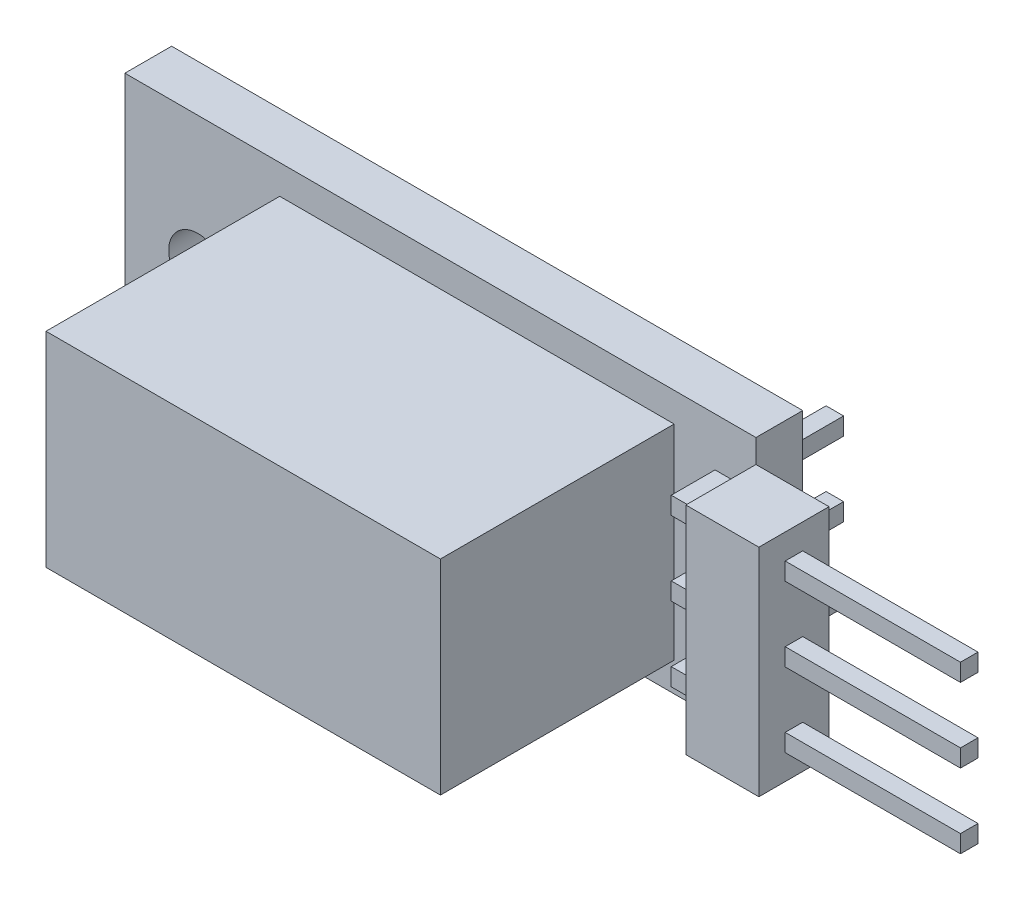
ISO-10303-21;
HEADER;
FILE_DESCRIPTION(('STEP AP214'),'2;1');
FILE_NAME('part.step','',(''),(''),'','','');
FILE_SCHEMA(('AUTOMOTIVE_DESIGN { 1 0 10303 214 1 1 1 1 }'));
ENDSEC;
DATA;
#1=APPLICATION_CONTEXT('core data for automotive mechanical design processes');
#2=APPLICATION_PROTOCOL_DEFINITION('international standard','automotive_design',2000,#1);
#3=PRODUCT_CONTEXT('',#1,'mechanical');
#4=PRODUCT('Part','Part','',(#3));
#5=PRODUCT_RELATED_PRODUCT_CATEGORY('part','',(#4));
#6=PRODUCT_DEFINITION_FORMATION('','',#4);
#7=PRODUCT_DEFINITION_CONTEXT('part definition',#1,'design');
#8=PRODUCT_DEFINITION('design','',#6,#7);
#9=PRODUCT_DEFINITION_SHAPE('','',#8);
#10=(LENGTH_UNIT() NAMED_UNIT(*) SI_UNIT(.MILLI.,.METRE.));
#11=(NAMED_UNIT(*) PLANE_ANGLE_UNIT() SI_UNIT($,.RADIAN.));
#12=(NAMED_UNIT(*) SI_UNIT($,.STERADIAN.) SOLID_ANGLE_UNIT());
#13=UNCERTAINTY_MEASURE_WITH_UNIT(LENGTH_MEASURE(1.E-05),#10,'distance_accuracy_value','');
#14=(GEOMETRIC_REPRESENTATION_CONTEXT(3) GLOBAL_UNCERTAINTY_ASSIGNED_CONTEXT((#13)) GLOBAL_UNIT_ASSIGNED_CONTEXT((#10,
#11,#12)) REPRESENTATION_CONTEXT('',''));
#15=CARTESIAN_POINT('',(0.,0.,0.));
#16=DIRECTION('',(0.,0.,1.));
#17=DIRECTION('',(1.,0.,0.));
#18=AXIS2_PLACEMENT_3D('',#15,#16,#17);
#19=CARTESIAN_POINT('',(30.1,6.74,2.5));
#20=DIRECTION('',(-1.,0.,0.));
#21=DIRECTION('',(0.,0.,1.));
#22=AXIS2_PLACEMENT_3D('',#19,#20,#21);
#23=PLANE('',#22);
#24=DIRECTION('',(0.,0.,1.));
#25=VECTOR('',#24,1.);
#26=CARTESIAN_POINT('',(30.1,7.34,2.5));
#27=LINE('',#26,#25);
#28=CARTESIAN_POINT('',(30.1,7.34,2.5));
#29=VERTEX_POINT('',#28);
#30=CARTESIAN_POINT('',(30.1,7.34,3.1));
#31=VERTEX_POINT('',#30);
#32=EDGE_CURVE('E129',#29,#31,#27,.T.);
#33=ORIENTED_EDGE('',*,*,#32,.T.);
#34=DIRECTION('',(0.,1.,0.));
#35=VECTOR('',#34,1.);
#36=CARTESIAN_POINT('',(30.1,6.74,3.1));
#37=LINE('',#36,#35);
#38=CARTESIAN_POINT('',(30.1,6.74,3.1));
#39=VERTEX_POINT('',#38);
#40=EDGE_CURVE('E12',#39,#31,#37,.T.);
#41=ORIENTED_EDGE('',*,*,#40,.F.);
#42=DIRECTION('',(0.,0.,1.));
#43=VECTOR('',#42,1.);
#44=CARTESIAN_POINT('',(30.1,6.74,2.5));
#45=LINE('',#44,#43);
#46=CARTESIAN_POINT('',(30.1,6.74,2.5));
#47=VERTEX_POINT('',#46);
#48=EDGE_CURVE('E139',#47,#39,#45,.T.);
#49=ORIENTED_EDGE('',*,*,#48,.F.);
#50=DIRECTION('',(0.,1.,0.));
#51=VECTOR('',#50,1.);
#52=CARTESIAN_POINT('',(30.1,6.74,2.5));
#53=LINE('',#52,#51);
#54=EDGE_CURVE('E125',#47,#29,#53,.T.);
#55=ORIENTED_EDGE('',*,*,#54,.T.);
#56=EDGE_LOOP('',(#33,#41,#49,#55));
#57=FACE_BOUND('',#56,.T.);
#58=ADVANCED_FACE('F45',(#57),#23,.F.);
#59=CARTESIAN_POINT('',(30.1,6.74,3.1));
#60=DIRECTION('',(0.,0.,-1.));
#61=DIRECTION('',(0.,1.,0.));
#62=AXIS2_PLACEMENT_3D('',#59,#60,#61);
#63=PLANE('',#62);
#64=DIRECTION('',(-1.,0.,0.));
#65=VECTOR('',#64,1.);
#66=CARTESIAN_POINT('',(30.1,7.34,3.1));
#67=LINE('',#66,#65);
#68=CARTESIAN_POINT('',(20.2,7.34,3.1));
#69=VERTEX_POINT('',#68);
#70=EDGE_CURVE('E132',#31,#69,#67,.T.);
#71=ORIENTED_EDGE('',*,*,#70,.T.);
#72=DIRECTION('',(0.,1.,0.));
#73=VECTOR('',#72,1.);
#74=CARTESIAN_POINT('',(20.2,6.74,3.1));
#75=LINE('',#74,#73);
#76=CARTESIAN_POINT('',(20.2,6.74,3.1));
#77=VERTEX_POINT('',#76);
#78=EDGE_CURVE('E53',#77,#69,#75,.T.);
#79=ORIENTED_EDGE('',*,*,#78,.F.);
#80=DIRECTION('',(-1.,0.,0.));
#81=VECTOR('',#80,1.);
#82=CARTESIAN_POINT('',(30.1,6.74,3.1));
#83=LINE('',#82,#81);
#84=EDGE_CURVE('E98',#39,#77,#83,.T.);
#85=ORIENTED_EDGE('',*,*,#84,.F.);
#86=ORIENTED_EDGE('',*,*,#40,.T.);
#87=EDGE_LOOP('',(#71,#79,#85,#86));
#88=FACE_BOUND('',#87,.T.);
#89=ADVANCED_FACE('F163',(#88),#63,.F.);
#90=CARTESIAN_POINT('',(20.2,6.74,3.1));
#91=DIRECTION('',(1.,0.,0.));
#92=DIRECTION('',(0.,0.,-1.));
#93=AXIS2_PLACEMENT_3D('',#90,#91,#92);
#94=PLANE('',#93);
#95=DIRECTION('',(0.,0.,-1.));
#96=VECTOR('',#95,1.);
#97=CARTESIAN_POINT('',(20.2,7.34,3.1));
#98=LINE('',#97,#96);
#99=CARTESIAN_POINT('',(20.2,7.34,-2.2));
#100=VERTEX_POINT('',#99);
#101=EDGE_CURVE('E134',#69,#100,#98,.T.);
#102=ORIENTED_EDGE('',*,*,#101,.T.);
#103=DIRECTION('',(0.,1.,0.));
#104=VECTOR('',#103,1.);
#105=CARTESIAN_POINT('',(20.2,6.74,-2.2));
#106=LINE('',#105,#104);
#107=CARTESIAN_POINT('',(20.2,6.74,-2.2));
#108=VERTEX_POINT('',#107);
#109=EDGE_CURVE('E120',#108,#100,#106,.T.);
#110=ORIENTED_EDGE('',*,*,#109,.F.);
#111=DIRECTION('',(0.,0.,-1.));
#112=VECTOR('',#111,1.);
#113=CARTESIAN_POINT('',(20.2,6.74,3.1));
#114=LINE('',#113,#112);
#115=EDGE_CURVE('E111',#77,#108,#114,.T.);
#116=ORIENTED_EDGE('',*,*,#115,.F.);
#117=ORIENTED_EDGE('',*,*,#78,.T.);
#118=EDGE_LOOP('',(#102,#110,#116,#117));
#119=FACE_BOUND('',#118,.T.);
#120=ADVANCED_FACE('F145',(#119),#94,.F.);
#121=CARTESIAN_POINT('',(20.2,6.74,-2.2));
#122=DIRECTION('',(0.,0.,1.));
#123=DIRECTION('',(0.,-1.,0.));
#124=AXIS2_PLACEMENT_3D('',#121,#122,#123);
#125=PLANE('',#124);
#126=DIRECTION('',(1.,0.,0.));
#127=VECTOR('',#126,1.);
#128=CARTESIAN_POINT('',(20.2,7.34,-2.2));
#129=LINE('',#128,#127);
#130=CARTESIAN_POINT('',(20.8,7.34,-2.2));
#131=VERTEX_POINT('',#130);
#132=EDGE_CURVE('E119',#100,#131,#129,.T.);
#133=ORIENTED_EDGE('',*,*,#132,.T.);
#134=DIRECTION('',(0.,1.,0.));
#135=VECTOR('',#134,1.);
#136=CARTESIAN_POINT('',(20.8,6.74,-2.2));
#137=LINE('',#136,#135);
#138=CARTESIAN_POINT('',(20.8,6.74,-2.2));
#139=VERTEX_POINT('',#138);
#140=EDGE_CURVE('E116',#139,#131,#137,.T.);
#141=ORIENTED_EDGE('',*,*,#140,.F.);
#142=DIRECTION('',(1.,0.,0.));
#143=VECTOR('',#142,1.);
#144=CARTESIAN_POINT('',(20.2,6.74,-2.2));
#145=LINE('',#144,#143);
#146=EDGE_CURVE('E105',#108,#139,#145,.T.);
#147=ORIENTED_EDGE('',*,*,#146,.F.);
#148=ORIENTED_EDGE('',*,*,#109,.T.);
#149=EDGE_LOOP('',(#133,#141,#147,#148));
#150=FACE_BOUND('',#149,.T.);
#151=ADVANCED_FACE('F117',(#150),#125,.F.);
#152=CARTESIAN_POINT('',(20.8,6.74,-2.2));
#153=DIRECTION('',(-1.,0.,0.));
#154=DIRECTION('',(0.,0.,1.));
#155=AXIS2_PLACEMENT_3D('',#152,#153,#154);
#156=PLANE('',#155);
#157=DIRECTION('',(0.,0.,1.));
#158=VECTOR('',#157,1.);
#159=CARTESIAN_POINT('',(20.8,7.34,-2.2));
#160=LINE('',#159,#158);
#161=CARTESIAN_POINT('',(20.8,7.34,2.5));
#162=VERTEX_POINT('',#161);
#163=EDGE_CURVE('E84',#131,#162,#160,.T.);
#164=ORIENTED_EDGE('',*,*,#163,.T.);
#165=DIRECTION('',(0.,1.,0.));
#166=VECTOR('',#165,1.);
#167=CARTESIAN_POINT('',(20.8,6.74,2.5));
#168=LINE('',#167,#166);
#169=CARTESIAN_POINT('',(20.8,6.74,2.5));
#170=VERTEX_POINT('',#169);
#171=EDGE_CURVE('E121',#170,#162,#168,.T.);
#172=ORIENTED_EDGE('',*,*,#171,.F.);
#173=DIRECTION('',(0.,0.,1.));
#174=VECTOR('',#173,1.);
#175=CARTESIAN_POINT('',(20.8,6.74,-2.2));
#176=LINE('',#175,#174);
#177=EDGE_CURVE('E109',#139,#170,#176,.T.);
#178=ORIENTED_EDGE('',*,*,#177,.F.);
#179=ORIENTED_EDGE('',*,*,#140,.T.);
#180=EDGE_LOOP('',(#164,#172,#178,#179));
#181=FACE_BOUND('',#180,.T.);
#182=ADVANCED_FACE('F123',(#181),#156,.F.);
#183=CARTESIAN_POINT('',(20.8,6.74,2.5));
#184=DIRECTION('',(0.,0.,1.));
#185=DIRECTION('',(0.,-1.,0.));
#186=AXIS2_PLACEMENT_3D('',#183,#184,#185);
#187=PLANE('',#186);
#188=DIRECTION('',(1.,0.,0.));
#189=VECTOR('',#188,1.);
#190=CARTESIAN_POINT('',(20.8,7.34,2.5));
#191=LINE('',#190,#189);
#192=EDGE_CURVE('E90',#162,#29,#191,.T.);
#193=ORIENTED_EDGE('',*,*,#192,.T.);
#194=ORIENTED_EDGE('',*,*,#54,.F.);
#195=DIRECTION('',(1.,0.,0.));
#196=VECTOR('',#195,1.);
#197=CARTESIAN_POINT('',(20.8,6.74,2.5));
#198=LINE('',#197,#196);
#199=EDGE_CURVE('E61',#170,#47,#198,.T.);
#200=ORIENTED_EDGE('',*,*,#199,.F.);
#201=ORIENTED_EDGE('',*,*,#171,.T.);
#202=EDGE_LOOP('',(#193,#194,#200,#201));
#203=FACE_BOUND('',#202,.T.);
#204=ADVANCED_FACE('F152',(#203),#187,.F.);
#205=CARTESIAN_POINT('',(0.,6.74,0.));
#206=DIRECTION('',(0.,-1.,0.));
#207=DIRECTION('',(0.,0.,-1.));
#208=AXIS2_PLACEMENT_3D('',#205,#206,#207);
#209=PLANE('',#208);
#210=ORIENTED_EDGE('',*,*,#48,.T.);
#211=ORIENTED_EDGE('',*,*,#84,.T.);
#212=ORIENTED_EDGE('',*,*,#115,.T.);
#213=ORIENTED_EDGE('',*,*,#146,.T.);
#214=ORIENTED_EDGE('',*,*,#177,.T.);
#215=ORIENTED_EDGE('',*,*,#199,.T.);
#216=EDGE_LOOP('',(#210,#211,#212,#213,#214,#215));
#217=FACE_BOUND('',#216,.T.);
#218=ADVANCED_FACE('F107',(#217),#209,.T.);
#219=CARTESIAN_POINT('',(0.,7.34,0.));
#220=DIRECTION('',(0.,-1.,0.));
#221=DIRECTION('',(0.,0.,-1.));
#222=AXIS2_PLACEMENT_3D('',#219,#220,#221);
#223=PLANE('',#222);
#224=ORIENTED_EDGE('',*,*,#32,.F.);
#225=ORIENTED_EDGE('',*,*,#192,.F.);
#226=ORIENTED_EDGE('',*,*,#163,.F.);
#227=ORIENTED_EDGE('',*,*,#132,.F.);
#228=ORIENTED_EDGE('',*,*,#101,.F.);
#229=ORIENTED_EDGE('',*,*,#70,.F.);
#230=EDGE_LOOP('',(#224,#225,#226,#227,#228,#229));
#231=FACE_BOUND('',#230,.T.);
#232=ADVANCED_FACE('F148',(#231),#223,.F.);
#233=CLOSED_SHELL('',(#58,#89,#120,#151,#182,#204,#218,#232));
#234=MANIFOLD_SOLID_BREP('B2',#233);
#235=CARTESIAN_POINT('',(30.1,4.2,2.5));
#236=DIRECTION('',(-1.,0.,0.));
#237=DIRECTION('',(0.,0.,1.));
#238=AXIS2_PLACEMENT_3D('',#235,#236,#237);
#239=PLANE('',#238);
#240=DIRECTION('',(0.,0.,1.));
#241=VECTOR('',#240,1.);
#242=CARTESIAN_POINT('',(30.1,4.8,2.5));
#243=LINE('',#242,#241);
#244=CARTESIAN_POINT('',(30.1,4.8,2.5));
#245=VERTEX_POINT('',#244);
#246=CARTESIAN_POINT('',(30.1,4.8,3.1));
#247=VERTEX_POINT('',#246);
#248=EDGE_CURVE('E314',#245,#247,#243,.T.);
#249=ORIENTED_EDGE('',*,*,#248,.T.);
#250=DIRECTION('',(0.,1.,0.));
#251=VECTOR('',#250,1.);
#252=CARTESIAN_POINT('',(30.1,4.2,3.1));
#253=LINE('',#252,#251);
#254=CARTESIAN_POINT('',(30.1,4.2,3.1));
#255=VERTEX_POINT('',#254);
#256=EDGE_CURVE('E43',#255,#247,#253,.T.);
#257=ORIENTED_EDGE('',*,*,#256,.F.);
#258=DIRECTION('',(0.,0.,1.));
#259=VECTOR('',#258,1.);
#260=CARTESIAN_POINT('',(30.1,4.2,2.5));
#261=LINE('',#260,#259);
#262=CARTESIAN_POINT('',(30.1,4.2,2.5));
#263=VERTEX_POINT('',#262);
#264=EDGE_CURVE('E324',#263,#255,#261,.T.);
#265=ORIENTED_EDGE('',*,*,#264,.F.);
#266=DIRECTION('',(0.,1.,0.));
#267=VECTOR('',#266,1.);
#268=CARTESIAN_POINT('',(30.1,4.2,2.5));
#269=LINE('',#268,#267);
#270=EDGE_CURVE('E310',#263,#245,#269,.T.);
#271=ORIENTED_EDGE('',*,*,#270,.T.);
#272=EDGE_LOOP('',(#249,#257,#265,#271));
#273=FACE_BOUND('',#272,.T.);
#274=ADVANCED_FACE('F230',(#273),#239,.F.);
#275=CARTESIAN_POINT('',(30.1,4.2,3.1));
#276=DIRECTION('',(0.,0.,-1.));
#277=DIRECTION('',(0.,1.,0.));
#278=AXIS2_PLACEMENT_3D('',#275,#276,#277);
#279=PLANE('',#278);
#280=DIRECTION('',(-1.,0.,0.));
#281=VECTOR('',#280,1.);
#282=CARTESIAN_POINT('',(30.1,4.8,3.1));
#283=LINE('',#282,#281);
#284=CARTESIAN_POINT('',(20.2,4.8,3.1));
#285=VERTEX_POINT('',#284);
#286=EDGE_CURVE('E317',#247,#285,#283,.T.);
#287=ORIENTED_EDGE('',*,*,#286,.T.);
#288=DIRECTION('',(0.,1.,0.));
#289=VECTOR('',#288,1.);
#290=CARTESIAN_POINT('',(20.2,4.2,3.1));
#291=LINE('',#290,#289);
#292=CARTESIAN_POINT('',(20.2,4.2,3.1));
#293=VERTEX_POINT('',#292);
#294=EDGE_CURVE('E238',#293,#285,#291,.T.);
#295=ORIENTED_EDGE('',*,*,#294,.F.);
#296=DIRECTION('',(-1.,0.,0.));
#297=VECTOR('',#296,1.);
#298=CARTESIAN_POINT('',(30.1,4.2,3.1));
#299=LINE('',#298,#297);
#300=EDGE_CURVE('E283',#255,#293,#299,.T.);
#301=ORIENTED_EDGE('',*,*,#300,.F.);
#302=ORIENTED_EDGE('',*,*,#256,.T.);
#303=EDGE_LOOP('',(#287,#295,#301,#302));
#304=FACE_BOUND('',#303,.T.);
#305=ADVANCED_FACE('F348',(#304),#279,.F.);
#306=CARTESIAN_POINT('',(20.2,4.2,3.1));
#307=DIRECTION('',(1.,0.,0.));
#308=DIRECTION('',(0.,0.,-1.));
#309=AXIS2_PLACEMENT_3D('',#306,#307,#308);
#310=PLANE('',#309);
#311=DIRECTION('',(0.,0.,-1.));
#312=VECTOR('',#311,1.);
#313=CARTESIAN_POINT('',(20.2,4.8,3.1));
#314=LINE('',#313,#312);
#315=CARTESIAN_POINT('',(20.2,4.8,-2.2));
#316=VERTEX_POINT('',#315);
#317=EDGE_CURVE('E319',#285,#316,#314,.T.);
#318=ORIENTED_EDGE('',*,*,#317,.T.);
#319=DIRECTION('',(0.,1.,0.));
#320=VECTOR('',#319,1.);
#321=CARTESIAN_POINT('',(20.2,4.2,-2.2));
#322=LINE('',#321,#320);
#323=CARTESIAN_POINT('',(20.2,4.2,-2.2));
#324=VERTEX_POINT('',#323);
#325=EDGE_CURVE('E305',#324,#316,#322,.T.);
#326=ORIENTED_EDGE('',*,*,#325,.F.);
#327=DIRECTION('',(0.,0.,-1.));
#328=VECTOR('',#327,1.);
#329=CARTESIAN_POINT('',(20.2,4.2,3.1));
#330=LINE('',#329,#328);
#331=EDGE_CURVE('E296',#293,#324,#330,.T.);
#332=ORIENTED_EDGE('',*,*,#331,.F.);
#333=ORIENTED_EDGE('',*,*,#294,.T.);
#334=EDGE_LOOP('',(#318,#326,#332,#333));
#335=FACE_BOUND('',#334,.T.);
#336=ADVANCED_FACE('F330',(#335),#310,.F.);
#337=CARTESIAN_POINT('',(20.2,4.2,-2.2));
#338=DIRECTION('',(0.,0.,1.));
#339=DIRECTION('',(0.,-1.,0.));
#340=AXIS2_PLACEMENT_3D('',#337,#338,#339);
#341=PLANE('',#340);
#342=DIRECTION('',(1.,0.,0.));
#343=VECTOR('',#342,1.);
#344=CARTESIAN_POINT('',(20.2,4.8,-2.2));
#345=LINE('',#344,#343);
#346=CARTESIAN_POINT('',(20.8,4.8,-2.2));
#347=VERTEX_POINT('',#346);
#348=EDGE_CURVE('E304',#316,#347,#345,.T.);
#349=ORIENTED_EDGE('',*,*,#348,.T.);
#350=DIRECTION('',(0.,1.,0.));
#351=VECTOR('',#350,1.);
#352=CARTESIAN_POINT('',(20.8,4.2,-2.2));
#353=LINE('',#352,#351);
#354=CARTESIAN_POINT('',(20.8,4.2,-2.2));
#355=VERTEX_POINT('',#354);
#356=EDGE_CURVE('E301',#355,#347,#353,.T.);
#357=ORIENTED_EDGE('',*,*,#356,.F.);
#358=DIRECTION('',(1.,0.,0.));
#359=VECTOR('',#358,1.);
#360=CARTESIAN_POINT('',(20.2,4.2,-2.2));
#361=LINE('',#360,#359);
#362=EDGE_CURVE('E290',#324,#355,#361,.T.);
#363=ORIENTED_EDGE('',*,*,#362,.F.);
#364=ORIENTED_EDGE('',*,*,#325,.T.);
#365=EDGE_LOOP('',(#349,#357,#363,#364));
#366=FACE_BOUND('',#365,.T.);
#367=ADVANCED_FACE('F302',(#366),#341,.F.);
#368=CARTESIAN_POINT('',(20.8,4.2,-2.2));
#369=DIRECTION('',(-1.,0.,0.));
#370=DIRECTION('',(0.,0.,1.));
#371=AXIS2_PLACEMENT_3D('',#368,#369,#370);
#372=PLANE('',#371);
#373=DIRECTION('',(0.,0.,1.));
#374=VECTOR('',#373,1.);
#375=CARTESIAN_POINT('',(20.8,4.8,-2.2));
#376=LINE('',#375,#374);
#377=CARTESIAN_POINT('',(20.8,4.8,2.5));
#378=VERTEX_POINT('',#377);
#379=EDGE_CURVE('E269',#347,#378,#376,.T.);
#380=ORIENTED_EDGE('',*,*,#379,.T.);
#381=DIRECTION('',(0.,1.,0.));
#382=VECTOR('',#381,1.);
#383=CARTESIAN_POINT('',(20.8,4.2,2.5));
#384=LINE('',#383,#382);
#385=CARTESIAN_POINT('',(20.8,4.2,2.5));
#386=VERTEX_POINT('',#385);
#387=EDGE_CURVE('E306',#386,#378,#384,.T.);
#388=ORIENTED_EDGE('',*,*,#387,.F.);
#389=DIRECTION('',(0.,0.,1.));
#390=VECTOR('',#389,1.);
#391=CARTESIAN_POINT('',(20.8,4.2,-2.2));
#392=LINE('',#391,#390);
#393=EDGE_CURVE('E294',#355,#386,#392,.T.);
#394=ORIENTED_EDGE('',*,*,#393,.F.);
#395=ORIENTED_EDGE('',*,*,#356,.T.);
#396=EDGE_LOOP('',(#380,#388,#394,#395));
#397=FACE_BOUND('',#396,.T.);
#398=ADVANCED_FACE('F308',(#397),#372,.F.);
#399=CARTESIAN_POINT('',(20.8,4.2,2.5));
#400=DIRECTION('',(0.,0.,1.));
#401=DIRECTION('',(0.,-1.,0.));
#402=AXIS2_PLACEMENT_3D('',#399,#400,#401);
#403=PLANE('',#402);
#404=DIRECTION('',(1.,0.,0.));
#405=VECTOR('',#404,1.);
#406=CARTESIAN_POINT('',(20.8,4.8,2.5));
#407=LINE('',#406,#405);
#408=EDGE_CURVE('E275',#378,#245,#407,.T.);
#409=ORIENTED_EDGE('',*,*,#408,.T.);
#410=ORIENTED_EDGE('',*,*,#270,.F.);
#411=DIRECTION('',(1.,0.,0.));
#412=VECTOR('',#411,1.);
#413=CARTESIAN_POINT('',(20.8,4.2,2.5));
#414=LINE('',#413,#412);
#415=EDGE_CURVE('E246',#386,#263,#414,.T.);
#416=ORIENTED_EDGE('',*,*,#415,.F.);
#417=ORIENTED_EDGE('',*,*,#387,.T.);
#418=EDGE_LOOP('',(#409,#410,#416,#417));
#419=FACE_BOUND('',#418,.T.);
#420=ADVANCED_FACE('F337',(#419),#403,.F.);
#421=CARTESIAN_POINT('',(0.,4.2,0.));
#422=DIRECTION('',(0.,-1.,0.));
#423=DIRECTION('',(0.,0.,-1.));
#424=AXIS2_PLACEMENT_3D('',#421,#422,#423);
#425=PLANE('',#424);
#426=ORIENTED_EDGE('',*,*,#264,.T.);
#427=ORIENTED_EDGE('',*,*,#300,.T.);
#428=ORIENTED_EDGE('',*,*,#331,.T.);
#429=ORIENTED_EDGE('',*,*,#362,.T.);
#430=ORIENTED_EDGE('',*,*,#393,.T.);
#431=ORIENTED_EDGE('',*,*,#415,.T.);
#432=EDGE_LOOP('',(#426,#427,#428,#429,#430,#431));
#433=FACE_BOUND('',#432,.T.);
#434=ADVANCED_FACE('F292',(#433),#425,.T.);
#435=CARTESIAN_POINT('',(0.,4.8,0.));
#436=DIRECTION('',(0.,-1.,0.));
#437=DIRECTION('',(0.,0.,-1.));
#438=AXIS2_PLACEMENT_3D('',#435,#436,#437);
#439=PLANE('',#438);
#440=ORIENTED_EDGE('',*,*,#248,.F.);
#441=ORIENTED_EDGE('',*,*,#408,.F.);
#442=ORIENTED_EDGE('',*,*,#379,.F.);
#443=ORIENTED_EDGE('',*,*,#348,.F.);
#444=ORIENTED_EDGE('',*,*,#317,.F.);
#445=ORIENTED_EDGE('',*,*,#286,.F.);
#446=EDGE_LOOP('',(#440,#441,#442,#443,#444,#445));
#447=FACE_BOUND('',#446,.T.);
#448=ADVANCED_FACE('F333',(#447),#439,.F.);
#449=CLOSED_SHELL('',(#274,#305,#336,#367,#398,#420,#434,#448));
#450=MANIFOLD_SOLID_BREP('B6',#449);
#451=CARTESIAN_POINT('',(30.1,1.66,2.5));
#452=DIRECTION('',(-1.,0.,0.));
#453=DIRECTION('',(0.,0.,1.));
#454=AXIS2_PLACEMENT_3D('',#451,#452,#453);
#455=PLANE('',#454);
#456=DIRECTION('',(0.,0.,1.));
#457=VECTOR('',#456,1.);
#458=CARTESIAN_POINT('',(30.1,2.26,2.5));
#459=LINE('',#458,#457);
#460=CARTESIAN_POINT('',(30.1,2.26,2.5));
#461=VERTEX_POINT('',#460);
#462=CARTESIAN_POINT('',(30.1,2.26,3.1));
#463=VERTEX_POINT('',#462);
#464=EDGE_CURVE('E499',#461,#463,#459,.T.);
#465=ORIENTED_EDGE('',*,*,#464,.T.);
#466=DIRECTION('',(0.,1.,0.));
#467=VECTOR('',#466,1.);
#468=CARTESIAN_POINT('',(30.1,1.66,3.1));
#469=LINE('',#468,#467);
#470=CARTESIAN_POINT('',(30.1,1.66,3.1));
#471=VERTEX_POINT('',#470);
#472=EDGE_CURVE('E228',#471,#463,#469,.T.);
#473=ORIENTED_EDGE('',*,*,#472,.F.);
#474=DIRECTION('',(0.,0.,1.));
#475=VECTOR('',#474,1.);
#476=CARTESIAN_POINT('',(30.1,1.66,2.5));
#477=LINE('',#476,#475);
#478=CARTESIAN_POINT('',(30.1,1.66,2.5));
#479=VERTEX_POINT('',#478);
#480=EDGE_CURVE('E509',#479,#471,#477,.T.);
#481=ORIENTED_EDGE('',*,*,#480,.F.);
#482=DIRECTION('',(0.,1.,0.));
#483=VECTOR('',#482,1.);
#484=CARTESIAN_POINT('',(30.1,1.66,2.5));
#485=LINE('',#484,#483);
#486=EDGE_CURVE('E495',#479,#461,#485,.T.);
#487=ORIENTED_EDGE('',*,*,#486,.T.);
#488=EDGE_LOOP('',(#465,#473,#481,#487));
#489=FACE_BOUND('',#488,.T.);
#490=ADVANCED_FACE('F415',(#489),#455,.F.);
#491=CARTESIAN_POINT('',(30.1,1.66,3.1));
#492=DIRECTION('',(0.,0.,-1.));
#493=DIRECTION('',(0.,1.,0.));
#494=AXIS2_PLACEMENT_3D('',#491,#492,#493);
#495=PLANE('',#494);
#496=DIRECTION('',(-1.,0.,0.));
#497=VECTOR('',#496,1.);
#498=CARTESIAN_POINT('',(30.1,2.26,3.1));
#499=LINE('',#498,#497);
#500=CARTESIAN_POINT('',(20.2,2.26,3.1));
#501=VERTEX_POINT('',#500);
#502=EDGE_CURVE('E502',#463,#501,#499,.T.);
#503=ORIENTED_EDGE('',*,*,#502,.T.);
#504=DIRECTION('',(0.,1.,0.));
#505=VECTOR('',#504,1.);
#506=CARTESIAN_POINT('',(20.2,1.66,3.1));
#507=LINE('',#506,#505);
#508=CARTESIAN_POINT('',(20.2,1.66,3.1));
#509=VERTEX_POINT('',#508);
#510=EDGE_CURVE('E423',#509,#501,#507,.T.);
#511=ORIENTED_EDGE('',*,*,#510,.F.);
#512=DIRECTION('',(-1.,0.,0.));
#513=VECTOR('',#512,1.);
#514=CARTESIAN_POINT('',(30.1,1.66,3.1));
#515=LINE('',#514,#513);
#516=EDGE_CURVE('E468',#471,#509,#515,.T.);
#517=ORIENTED_EDGE('',*,*,#516,.F.);
#518=ORIENTED_EDGE('',*,*,#472,.T.);
#519=EDGE_LOOP('',(#503,#511,#517,#518));
#520=FACE_BOUND('',#519,.T.);
#521=ADVANCED_FACE('F533',(#520),#495,.F.);
#522=CARTESIAN_POINT('',(20.2,1.66,3.1));
#523=DIRECTION('',(1.,0.,0.));
#524=DIRECTION('',(0.,0.,-1.));
#525=AXIS2_PLACEMENT_3D('',#522,#523,#524);
#526=PLANE('',#525);
#527=DIRECTION('',(0.,0.,-1.));
#528=VECTOR('',#527,1.);
#529=CARTESIAN_POINT('',(20.2,2.26,3.1));
#530=LINE('',#529,#528);
#531=CARTESIAN_POINT('',(20.2,2.26,-2.2));
#532=VERTEX_POINT('',#531);
#533=EDGE_CURVE('E504',#501,#532,#530,.T.);
#534=ORIENTED_EDGE('',*,*,#533,.T.);
#535=DIRECTION('',(0.,1.,0.));
#536=VECTOR('',#535,1.);
#537=CARTESIAN_POINT('',(20.2,1.66,-2.2));
#538=LINE('',#537,#536);
#539=CARTESIAN_POINT('',(20.2,1.66,-2.2));
#540=VERTEX_POINT('',#539);
#541=EDGE_CURVE('E490',#540,#532,#538,.T.);
#542=ORIENTED_EDGE('',*,*,#541,.F.);
#543=DIRECTION('',(0.,0.,-1.));
#544=VECTOR('',#543,1.);
#545=CARTESIAN_POINT('',(20.2,1.66,3.1));
#546=LINE('',#545,#544);
#547=EDGE_CURVE('E481',#509,#540,#546,.T.);
#548=ORIENTED_EDGE('',*,*,#547,.F.);
#549=ORIENTED_EDGE('',*,*,#510,.T.);
#550=EDGE_LOOP('',(#534,#542,#548,#549));
#551=FACE_BOUND('',#550,.T.);
#552=ADVANCED_FACE('F515',(#551),#526,.F.);
#553=CARTESIAN_POINT('',(20.2,1.66,-2.2));
#554=DIRECTION('',(0.,0.,1.));
#555=DIRECTION('',(0.,-1.,0.));
#556=AXIS2_PLACEMENT_3D('',#553,#554,#555);
#557=PLANE('',#556);
#558=DIRECTION('',(1.,0.,0.));
#559=VECTOR('',#558,1.);
#560=CARTESIAN_POINT('',(20.2,2.26,-2.2));
#561=LINE('',#560,#559);
#562=CARTESIAN_POINT('',(20.8,2.26,-2.2));
#563=VERTEX_POINT('',#562);
#564=EDGE_CURVE('E489',#532,#563,#561,.T.);
#565=ORIENTED_EDGE('',*,*,#564,.T.);
#566=DIRECTION('',(0.,1.,0.));
#567=VECTOR('',#566,1.);
#568=CARTESIAN_POINT('',(20.8,1.66,-2.2));
#569=LINE('',#568,#567);
#570=CARTESIAN_POINT('',(20.8,1.66,-2.2));
#571=VERTEX_POINT('',#570);
#572=EDGE_CURVE('E486',#571,#563,#569,.T.);
#573=ORIENTED_EDGE('',*,*,#572,.F.);
#574=DIRECTION('',(1.,0.,0.));
#575=VECTOR('',#574,1.);
#576=CARTESIAN_POINT('',(20.2,1.66,-2.2));
#577=LINE('',#576,#575);
#578=EDGE_CURVE('E475',#540,#571,#577,.T.);
#579=ORIENTED_EDGE('',*,*,#578,.F.);
#580=ORIENTED_EDGE('',*,*,#541,.T.);
#581=EDGE_LOOP('',(#565,#573,#579,#580));
#582=FACE_BOUND('',#581,.T.);
#583=ADVANCED_FACE('F487',(#582),#557,.F.);
#584=CARTESIAN_POINT('',(20.8,1.66,-2.2));
#585=DIRECTION('',(-1.,0.,0.));
#586=DIRECTION('',(0.,0.,1.));
#587=AXIS2_PLACEMENT_3D('',#584,#585,#586);
#588=PLANE('',#587);
#589=DIRECTION('',(0.,0.,1.));
#590=VECTOR('',#589,1.);
#591=CARTESIAN_POINT('',(20.8,2.26,-2.2));
#592=LINE('',#591,#590);
#593=CARTESIAN_POINT('',(20.8,2.26,2.5));
#594=VERTEX_POINT('',#593);
#595=EDGE_CURVE('E454',#563,#594,#592,.T.);
#596=ORIENTED_EDGE('',*,*,#595,.T.);
#597=DIRECTION('',(0.,1.,0.));
#598=VECTOR('',#597,1.);
#599=CARTESIAN_POINT('',(20.8,1.66,2.5));
#600=LINE('',#599,#598);
#601=CARTESIAN_POINT('',(20.8,1.66,2.5));
#602=VERTEX_POINT('',#601);
#603=EDGE_CURVE('E491',#602,#594,#600,.T.);
#604=ORIENTED_EDGE('',*,*,#603,.F.);
#605=DIRECTION('',(0.,0.,1.));
#606=VECTOR('',#605,1.);
#607=CARTESIAN_POINT('',(20.8,1.66,-2.2));
#608=LINE('',#607,#606);
#609=EDGE_CURVE('E479',#571,#602,#608,.T.);
#610=ORIENTED_EDGE('',*,*,#609,.F.);
#611=ORIENTED_EDGE('',*,*,#572,.T.);
#612=EDGE_LOOP('',(#596,#604,#610,#611));
#613=FACE_BOUND('',#612,.T.);
#614=ADVANCED_FACE('F493',(#613),#588,.F.);
#615=CARTESIAN_POINT('',(20.8,1.66,2.5));
#616=DIRECTION('',(0.,0.,1.));
#617=DIRECTION('',(0.,-1.,0.));
#618=AXIS2_PLACEMENT_3D('',#615,#616,#617);
#619=PLANE('',#618);
#620=DIRECTION('',(1.,0.,0.));
#621=VECTOR('',#620,1.);
#622=CARTESIAN_POINT('',(20.8,2.26,2.5));
#623=LINE('',#622,#621);
#624=EDGE_CURVE('E460',#594,#461,#623,.T.);
#625=ORIENTED_EDGE('',*,*,#624,.T.);
#626=ORIENTED_EDGE('',*,*,#486,.F.);
#627=DIRECTION('',(1.,0.,0.));
#628=VECTOR('',#627,1.);
#629=CARTESIAN_POINT('',(20.8,1.66,2.5));
#630=LINE('',#629,#628);
#631=EDGE_CURVE('E431',#602,#479,#630,.T.);
#632=ORIENTED_EDGE('',*,*,#631,.F.);
#633=ORIENTED_EDGE('',*,*,#603,.T.);
#634=EDGE_LOOP('',(#625,#626,#632,#633));
#635=FACE_BOUND('',#634,.T.);
#636=ADVANCED_FACE('F522',(#635),#619,.F.);
#637=CARTESIAN_POINT('',(0.,1.66,0.));
#638=DIRECTION('',(0.,-1.,0.));
#639=DIRECTION('',(0.,0.,-1.));
#640=AXIS2_PLACEMENT_3D('',#637,#638,#639);
#641=PLANE('',#640);
#642=ORIENTED_EDGE('',*,*,#480,.T.);
#643=ORIENTED_EDGE('',*,*,#516,.T.);
#644=ORIENTED_EDGE('',*,*,#547,.T.);
#645=ORIENTED_EDGE('',*,*,#578,.T.);
#646=ORIENTED_EDGE('',*,*,#609,.T.);
#647=ORIENTED_EDGE('',*,*,#631,.T.);
#648=EDGE_LOOP('',(#642,#643,#644,#645,#646,#647));
#649=FACE_BOUND('',#648,.T.);
#650=ADVANCED_FACE('F477',(#649),#641,.T.);
#651=CARTESIAN_POINT('',(0.,2.26,0.));
#652=DIRECTION('',(0.,-1.,0.));
#653=DIRECTION('',(0.,0.,-1.));
#654=AXIS2_PLACEMENT_3D('',#651,#652,#653);
#655=PLANE('',#654);
#656=ORIENTED_EDGE('',*,*,#464,.F.);
#657=ORIENTED_EDGE('',*,*,#624,.F.);
#658=ORIENTED_EDGE('',*,*,#595,.F.);
#659=ORIENTED_EDGE('',*,*,#564,.F.);
#660=ORIENTED_EDGE('',*,*,#533,.F.);
#661=ORIENTED_EDGE('',*,*,#502,.F.);
#662=EDGE_LOOP('',(#656,#657,#658,#659,#660,#661));
#663=FACE_BOUND('',#662,.T.);
#664=ADVANCED_FACE('F518',(#663),#655,.F.);
#665=CLOSED_SHELL('',(#490,#521,#552,#583,#614,#636,#650,#664));
#666=MANIFOLD_SOLID_BREP('B37',#665);
#667=CARTESIAN_POINT('',(24.1,8.2,1.6));
#668=DIRECTION('',(0.,0.,1.));
#669=DIRECTION('',(0.,-1.,0.));
#670=AXIS2_PLACEMENT_3D('',#667,#668,#669);
#671=PLANE('',#670);
#672=DIRECTION('',(0.,1.,0.));
#673=VECTOR('',#672,1.);
#674=CARTESIAN_POINT('',(21.6,8.2,1.6));
#675=LINE('',#674,#673);
#676=CARTESIAN_POINT('',(21.6,0.8,1.6));
#677=VERTEX_POINT('',#676);
#678=CARTESIAN_POINT('',(21.6,8.2,1.6));
#679=VERTEX_POINT('',#678);
#680=EDGE_CURVE('E663',#677,#679,#675,.T.);
#681=ORIENTED_EDGE('',*,*,#680,.T.);
#682=DIRECTION('',(-1.,0.,0.));
#683=VECTOR('',#682,1.);
#684=CARTESIAN_POINT('',(24.1,8.2,1.6));
#685=LINE('',#684,#683);
#686=CARTESIAN_POINT('',(24.1,8.2,1.6));
#687=VERTEX_POINT('',#686);
#688=EDGE_CURVE('E413',#687,#679,#685,.T.);
#689=ORIENTED_EDGE('',*,*,#688,.F.);
#690=DIRECTION('',(0.,1.,0.));
#691=VECTOR('',#690,1.);
#692=CARTESIAN_POINT('',(24.1,8.2,1.6));
#693=LINE('',#692,#691);
#694=CARTESIAN_POINT('',(24.1,0.8,1.6));
#695=VERTEX_POINT('',#694);
#696=EDGE_CURVE('E651',#695,#687,#693,.T.);
#697=ORIENTED_EDGE('',*,*,#696,.F.);
#698=DIRECTION('',(-1.,0.,0.));
#699=VECTOR('',#698,1.);
#700=CARTESIAN_POINT('',(24.1,0.8,1.6));
#701=LINE('',#700,#699);
#702=EDGE_CURVE('E659',#695,#677,#701,.T.);
#703=ORIENTED_EDGE('',*,*,#702,.T.);
#704=EDGE_LOOP('',(#681,#689,#697,#703));
#705=FACE_BOUND('',#704,.T.);
#706=ADVANCED_FACE('F600',(#705),#671,.F.);
#707=CARTESIAN_POINT('',(24.1,8.2,1.6));
#708=DIRECTION('',(0.,-1.,0.));
#709=DIRECTION('',(0.,0.,-1.));
#710=AXIS2_PLACEMENT_3D('',#707,#708,#709);
#711=PLANE('',#710);
#712=DIRECTION('',(0.,0.,1.));
#713=VECTOR('',#712,1.);
#714=CARTESIAN_POINT('',(21.6,8.2,1.6));
#715=LINE('',#714,#713);
#716=CARTESIAN_POINT('',(21.6,8.2,4.));
#717=VERTEX_POINT('',#716);
#718=EDGE_CURVE('E655',#679,#717,#715,.T.);
#719=ORIENTED_EDGE('',*,*,#718,.T.);
#720=DIRECTION('',(-1.,0.,0.));
#721=VECTOR('',#720,1.);
#722=CARTESIAN_POINT('',(24.1,8.2,4.));
#723=LINE('',#722,#721);
#724=CARTESIAN_POINT('',(24.1,8.2,4.));
#725=VERTEX_POINT('',#724);
#726=EDGE_CURVE('E608',#725,#717,#723,.T.);
#727=ORIENTED_EDGE('',*,*,#726,.F.);
#728=DIRECTION('',(0.,0.,1.));
#729=VECTOR('',#728,1.);
#730=CARTESIAN_POINT('',(24.1,8.2,1.6));
#731=LINE('',#730,#729);
#732=EDGE_CURVE('E646',#687,#725,#731,.T.);
#733=ORIENTED_EDGE('',*,*,#732,.F.);
#734=ORIENTED_EDGE('',*,*,#688,.T.);
#735=EDGE_LOOP('',(#719,#727,#733,#734));
#736=FACE_BOUND('',#735,.T.);
#737=ADVANCED_FACE('F654',(#736),#711,.F.);
#738=CARTESIAN_POINT('',(24.1,8.2,4.));
#739=DIRECTION('',(0.,0.,-1.));
#740=DIRECTION('',(0.,1.,0.));
#741=AXIS2_PLACEMENT_3D('',#738,#739,#740);
#742=PLANE('',#741);
#743=DIRECTION('',(0.,-1.,0.));
#744=VECTOR('',#743,1.);
#745=CARTESIAN_POINT('',(21.6,8.2,4.));
#746=LINE('',#745,#744);
#747=CARTESIAN_POINT('',(21.6,0.799999999999999,4.));
#748=VERTEX_POINT('',#747);
#749=EDGE_CURVE('E633',#717,#748,#746,.T.);
#750=ORIENTED_EDGE('',*,*,#749,.T.);
#751=DIRECTION('',(-1.,0.,0.));
#752=VECTOR('',#751,1.);
#753=CARTESIAN_POINT('',(24.1,0.799999999999999,4.));
#754=LINE('',#753,#752);
#755=CARTESIAN_POINT('',(24.1,0.799999999999999,4.));
#756=VERTEX_POINT('',#755);
#757=EDGE_CURVE('E656',#756,#748,#754,.T.);
#758=ORIENTED_EDGE('',*,*,#757,.F.);
#759=DIRECTION('',(0.,-1.,0.));
#760=VECTOR('',#759,1.);
#761=CARTESIAN_POINT('',(24.1,8.2,4.));
#762=LINE('',#761,#760);
#763=EDGE_CURVE('E649',#725,#756,#762,.T.);
#764=ORIENTED_EDGE('',*,*,#763,.F.);
#765=ORIENTED_EDGE('',*,*,#726,.T.);
#766=EDGE_LOOP('',(#750,#758,#764,#765));
#767=FACE_BOUND('',#766,.T.);
#768=ADVANCED_FACE('F657',(#767),#742,.F.);
#769=CARTESIAN_POINT('',(24.1,0.8,1.6));
#770=DIRECTION('',(0.,1.,0.));
#771=DIRECTION('',(0.,0.,1.));
#772=AXIS2_PLACEMENT_3D('',#769,#770,#771);
#773=PLANE('',#772);
#774=DIRECTION('',(0.,0.,-1.));
#775=VECTOR('',#774,1.);
#776=CARTESIAN_POINT('',(21.6,0.8,1.6));
#777=LINE('',#776,#775);
#778=EDGE_CURVE('E639',#748,#677,#777,.T.);
#779=ORIENTED_EDGE('',*,*,#778,.T.);
#780=ORIENTED_EDGE('',*,*,#702,.F.);
#781=DIRECTION('',(0.,0.,-1.));
#782=VECTOR('',#781,1.);
#783=CARTESIAN_POINT('',(24.1,0.8,1.6));
#784=LINE('',#783,#782);
#785=EDGE_CURVE('E616',#756,#695,#784,.T.);
#786=ORIENTED_EDGE('',*,*,#785,.F.);
#787=ORIENTED_EDGE('',*,*,#757,.T.);
#788=EDGE_LOOP('',(#779,#780,#786,#787));
#789=FACE_BOUND('',#788,.T.);
#790=ADVANCED_FACE('F670',(#789),#773,.F.);
#791=CARTESIAN_POINT('',(24.1,0.,0.));
#792=DIRECTION('',(-1.,0.,0.));
#793=DIRECTION('',(0.,0.,1.));
#794=AXIS2_PLACEMENT_3D('',#791,#792,#793);
#795=PLANE('',#794);
#796=ORIENTED_EDGE('',*,*,#696,.T.);
#797=ORIENTED_EDGE('',*,*,#732,.T.);
#798=ORIENTED_EDGE('',*,*,#763,.T.);
#799=ORIENTED_EDGE('',*,*,#785,.T.);
#800=EDGE_LOOP('',(#796,#797,#798,#799));
#801=FACE_BOUND('',#800,.T.);
#802=ADVANCED_FACE('F647',(#801),#795,.F.);
#803=CARTESIAN_POINT('',(21.6,0.,0.));
#804=DIRECTION('',(-1.,0.,0.));
#805=DIRECTION('',(0.,0.,1.));
#806=AXIS2_PLACEMENT_3D('',#803,#804,#805);
#807=PLANE('',#806);
#808=ORIENTED_EDGE('',*,*,#680,.F.);
#809=ORIENTED_EDGE('',*,*,#778,.F.);
#810=ORIENTED_EDGE('',*,*,#749,.F.);
#811=ORIENTED_EDGE('',*,*,#718,.F.);
#812=EDGE_LOOP('',(#808,#809,#810,#811));
#813=FACE_BOUND('',#812,.T.);
#814=ADVANCED_FACE('F673',(#813),#807,.T.);
#815=CLOSED_SHELL('',(#706,#737,#768,#790,#802,#814));
#816=MANIFOLD_SOLID_BREP('B222',#815);
#817=CARTESIAN_POINT('',(5.3,0.999999999999999,-0.9));
#818=DIRECTION('',(-1.,0.,0.));
#819=DIRECTION('',(0.,0.,1.));
#820=AXIS2_PLACEMENT_3D('',#817,#818,#819);
#821=PLANE('',#820);
#822=DIRECTION('',(0.,0.,1.));
#823=VECTOR('',#822,1.);
#824=CARTESIAN_POINT('',(5.3,0.999999999999999,-0.9));
#825=LINE('',#824,#823);
#826=CARTESIAN_POINT('',(5.3,0.999999999999999,-0.9));
#827=VERTEX_POINT('',#826);
#828=CARTESIAN_POINT('',(5.3,0.999999999999999,9.6));
#829=VERTEX_POINT('',#828);
#830=EDGE_CURVE('E735',#827,#829,#825,.T.);
#831=ORIENTED_EDGE('',*,*,#830,.T.);
#832=DIRECTION('',(0.,-1.,0.));
#833=VECTOR('',#832,1.);
#834=CARTESIAN_POINT('',(5.3,0.999999999999999,9.6));
#835=LINE('',#834,#833);
#836=CARTESIAN_POINT('',(5.3,8.,9.6));
#837=VERTEX_POINT('',#836);
#838=EDGE_CURVE('E772',#837,#829,#835,.T.);
#839=ORIENTED_EDGE('',*,*,#838,.F.);
#840=DIRECTION('',(0.,0.,1.));
#841=VECTOR('',#840,1.);
#842=CARTESIAN_POINT('',(5.3,8.,-0.9));
#843=LINE('',#842,#841);
#844=CARTESIAN_POINT('',(5.3,8.,-0.9));
#845=VERTEX_POINT('',#844);
#846=EDGE_CURVE('E598',#845,#837,#843,.T.);
#847=ORIENTED_EDGE('',*,*,#846,.F.);
#848=DIRECTION('',(0.,-1.,0.));
#849=VECTOR('',#848,1.);
#850=CARTESIAN_POINT('',(5.3,0.999999999999999,-0.9));
#851=LINE('',#850,#849);
#852=EDGE_CURVE('E773',#845,#827,#851,.T.);
#853=ORIENTED_EDGE('',*,*,#852,.T.);
#854=EDGE_LOOP('',(#831,#839,#847,#853));
#855=FACE_BOUND('',#854,.T.);
#856=ADVANCED_FACE('F732',(#855),#821,.T.);
#857=CARTESIAN_POINT('',(5.3,8.,-0.9));
#858=DIRECTION('',(0.,1.,0.));
#859=DIRECTION('',(0.,0.,1.));
#860=AXIS2_PLACEMENT_3D('',#857,#858,#859);
#861=PLANE('',#860);
#862=ORIENTED_EDGE('',*,*,#846,.T.);
#863=DIRECTION('',(-1.,0.,0.));
#864=VECTOR('',#863,1.);
#865=CARTESIAN_POINT('',(5.3,8.,9.6));
#866=LINE('',#865,#864);
#867=CARTESIAN_POINT('',(18.8,8.,9.6));
#868=VERTEX_POINT('',#867);
#869=EDGE_CURVE('E789',#868,#837,#866,.T.);
#870=ORIENTED_EDGE('',*,*,#869,.F.);
#871=DIRECTION('',(0.,0.,1.));
#872=VECTOR('',#871,1.);
#873=CARTESIAN_POINT('',(18.8,8.,-0.9));
#874=LINE('',#873,#872);
#875=CARTESIAN_POINT('',(18.8,8.,-0.9));
#876=VERTEX_POINT('',#875);
#877=EDGE_CURVE('E740',#876,#868,#874,.T.);
#878=ORIENTED_EDGE('',*,*,#877,.F.);
#879=DIRECTION('',(-1.,0.,0.));
#880=VECTOR('',#879,1.);
#881=CARTESIAN_POINT('',(5.3,8.,-0.9));
#882=LINE('',#881,#880);
#883=EDGE_CURVE('E778',#876,#845,#882,.T.);
#884=ORIENTED_EDGE('',*,*,#883,.T.);
#885=EDGE_LOOP('',(#862,#870,#878,#884));
#886=FACE_BOUND('',#885,.T.);
#887=ADVANCED_FACE('F804',(#886),#861,.T.);
#888=CARTESIAN_POINT('',(18.8,1.,-0.9));
#889=DIRECTION('',(1.,0.,0.));
#890=DIRECTION('',(0.,0.,-1.));
#891=AXIS2_PLACEMENT_3D('',#888,#889,#890);
#892=PLANE('',#891);
#893=ORIENTED_EDGE('',*,*,#877,.T.);
#894=DIRECTION('',(0.,1.,0.));
#895=VECTOR('',#894,1.);
#896=CARTESIAN_POINT('',(18.8,1.,9.6));
#897=LINE('',#896,#895);
#898=CARTESIAN_POINT('',(18.8,1.,9.6));
#899=VERTEX_POINT('',#898);
#900=EDGE_CURVE('E785',#899,#868,#897,.T.);
#901=ORIENTED_EDGE('',*,*,#900,.F.);
#902=DIRECTION('',(0.,0.,1.));
#903=VECTOR('',#902,1.);
#904=CARTESIAN_POINT('',(18.8,1.,-0.9));
#905=LINE('',#904,#903);
#906=CARTESIAN_POINT('',(18.8,1.,-0.9));
#907=VERTEX_POINT('',#906);
#908=EDGE_CURVE('E777',#907,#899,#905,.T.);
#909=ORIENTED_EDGE('',*,*,#908,.F.);
#910=DIRECTION('',(0.,1.,0.));
#911=VECTOR('',#910,1.);
#912=CARTESIAN_POINT('',(18.8,1.,-0.9));
#913=LINE('',#912,#911);
#914=EDGE_CURVE('E797',#907,#876,#913,.T.);
#915=ORIENTED_EDGE('',*,*,#914,.T.);
#916=EDGE_LOOP('',(#893,#901,#909,#915));
#917=FACE_BOUND('',#916,.T.);
#918=ADVANCED_FACE('F801',(#917),#892,.T.);
#919=CARTESIAN_POINT('',(5.3,0.999999999999999,-0.9));
#920=DIRECTION('',(0.,-1.,0.));
#921=DIRECTION('',(1.,0.,0.));
#922=AXIS2_PLACEMENT_3D('',#919,#920,#921);
#923=PLANE('',#922);
#924=ORIENTED_EDGE('',*,*,#908,.T.);
#925=DIRECTION('',(1.,0.,0.));
#926=VECTOR('',#925,1.);
#927=CARTESIAN_POINT('',(5.3,0.999999999999999,9.6));
#928=LINE('',#927,#926);
#929=EDGE_CURVE('E780',#829,#899,#928,.T.);
#930=ORIENTED_EDGE('',*,*,#929,.F.);
#931=ORIENTED_EDGE('',*,*,#830,.F.);
#932=DIRECTION('',(1.,0.,0.));
#933=VECTOR('',#932,1.);
#934=CARTESIAN_POINT('',(5.3,0.999999999999999,-0.9));
#935=LINE('',#934,#933);
#936=EDGE_CURVE('E795',#827,#907,#935,.T.);
#937=ORIENTED_EDGE('',*,*,#936,.T.);
#938=EDGE_LOOP('',(#924,#930,#931,#937));
#939=FACE_BOUND('',#938,.T.);
#940=ADVANCED_FACE('F781',(#939),#923,.T.);
#941=CARTESIAN_POINT('',(0.,0.,-0.9));
#942=DIRECTION('',(0.,0.,-1.));
#943=DIRECTION('',(-1.,0.,0.));
#944=AXIS2_PLACEMENT_3D('',#941,#942,#943);
#945=PLANE('',#944);
#946=ORIENTED_EDGE('',*,*,#852,.F.);
#947=ORIENTED_EDGE('',*,*,#883,.F.);
#948=ORIENTED_EDGE('',*,*,#914,.F.);
#949=ORIENTED_EDGE('',*,*,#936,.F.);
#950=EDGE_LOOP('',(#946,#947,#948,#949));
#951=FACE_BOUND('',#950,.T.);
#952=ADVANCED_FACE('F806',(#951),#945,.T.);
#953=CARTESIAN_POINT('',(0.,0.,9.6));
#954=DIRECTION('',(0.,0.,-1.));
#955=DIRECTION('',(-1.,0.,0.));
#956=AXIS2_PLACEMENT_3D('',#953,#954,#955);
#957=PLANE('',#956);
#958=ORIENTED_EDGE('',*,*,#838,.T.);
#959=ORIENTED_EDGE('',*,*,#929,.T.);
#960=ORIENTED_EDGE('',*,*,#900,.T.);
#961=ORIENTED_EDGE('',*,*,#869,.T.);
#962=EDGE_LOOP('',(#958,#959,#960,#961));
#963=FACE_BOUND('',#962,.T.);
#964=ADVANCED_FACE('F788',(#963),#957,.F.);
#965=CLOSED_SHELL('',(#856,#887,#918,#940,#952,#964));
#966=MANIFOLD_SOLID_BREP('B407',#965);
#967=CARTESIAN_POINT('',(0.,0.,1.6));
#968=DIRECTION('',(1.,0.,0.));
#969=DIRECTION('',(0.,0.,-1.));
#970=AXIS2_PLACEMENT_3D('',#967,#968,#969);
#971=PLANE('',#970);
#972=DIRECTION('',(0.,-1.,0.));
#973=VECTOR('',#972,1.);
#974=CARTESIAN_POINT('',(0.,0.,0.));
#975=LINE('',#974,#973);
#976=CARTESIAN_POINT('',(0.,9.,0.));
#977=VERTEX_POINT('',#976);
#978=CARTESIAN_POINT('',(0.,0.,0.));
#979=VERTEX_POINT('',#978);
#980=EDGE_CURVE('E920',#977,#979,#975,.T.);
#981=ORIENTED_EDGE('',*,*,#980,.T.);
#982=DIRECTION('',(0.,0.,-1.));
#983=VECTOR('',#982,1.);
#984=CARTESIAN_POINT('',(0.,0.,1.6));
#985=LINE('',#984,#983);
#986=CARTESIAN_POINT('',(0.,0.,1.6));
#987=VERTEX_POINT('',#986);
#988=EDGE_CURVE('E730',#987,#979,#985,.T.);
#989=ORIENTED_EDGE('',*,*,#988,.F.);
#990=DIRECTION('',(0.,-1.,0.));
#991=VECTOR('',#990,1.);
#992=CARTESIAN_POINT('',(0.,0.,1.6));
#993=LINE('',#992,#991);
#994=CARTESIAN_POINT('',(0.,9.,1.6));
#995=VERTEX_POINT('',#994);
#996=EDGE_CURVE('E907',#995,#987,#993,.T.);
#997=ORIENTED_EDGE('',*,*,#996,.F.);
#998=DIRECTION('',(0.,0.,-1.));
#999=VECTOR('',#998,1.);
#1000=CARTESIAN_POINT('',(0.,9.,1.6));
#1001=LINE('',#1000,#999);
#1002=EDGE_CURVE('E916',#995,#977,#1001,.T.);
#1003=ORIENTED_EDGE('',*,*,#1002,.T.);
#1004=EDGE_LOOP('',(#981,#989,#997,#1003));
#1005=FACE_BOUND('',#1004,.T.);
#1006=ADVANCED_FACE('F855',(#1005),#971,.F.);
#1007=CARTESIAN_POINT('',(0.,0.,1.6));
#1008=DIRECTION('',(0.,1.,0.));
#1009=DIRECTION('',(0.,0.,1.));
#1010=AXIS2_PLACEMENT_3D('',#1007,#1008,#1009);
#1011=PLANE('',#1010);
#1012=DIRECTION('',(1.,0.,0.));
#1013=VECTOR('',#1012,1.);
#1014=CARTESIAN_POINT('',(0.,0.,0.));
#1015=LINE('',#1014,#1013);
#1016=CARTESIAN_POINT('',(21.6,0.,0.));
#1017=VERTEX_POINT('',#1016);
#1018=EDGE_CURVE('E911',#979,#1017,#1015,.T.);
#1019=ORIENTED_EDGE('',*,*,#1018,.T.);
#1020=DIRECTION('',(0.,0.,-1.));
#1021=VECTOR('',#1020,1.);
#1022=CARTESIAN_POINT('',(21.6,0.,1.6));
#1023=LINE('',#1022,#1021);
#1024=CARTESIAN_POINT('',(21.6,0.,1.6));
#1025=VERTEX_POINT('',#1024);
#1026=EDGE_CURVE('E864',#1025,#1017,#1023,.T.);
#1027=ORIENTED_EDGE('',*,*,#1026,.F.);
#1028=DIRECTION('',(1.,0.,0.));
#1029=VECTOR('',#1028,1.);
#1030=CARTESIAN_POINT('',(0.,0.,1.6));
#1031=LINE('',#1030,#1029);
#1032=EDGE_CURVE('E902',#987,#1025,#1031,.T.);
#1033=ORIENTED_EDGE('',*,*,#1032,.F.);
#1034=ORIENTED_EDGE('',*,*,#988,.T.);
#1035=EDGE_LOOP('',(#1019,#1027,#1033,#1034));
#1036=FACE_BOUND('',#1035,.T.);
#1037=ADVANCED_FACE('F910',(#1036),#1011,.F.);
#1038=CARTESIAN_POINT('',(21.6,0.,1.6));
#1039=DIRECTION('',(-1.,0.,0.));
#1040=DIRECTION('',(0.,0.,1.));
#1041=AXIS2_PLACEMENT_3D('',#1038,#1039,#1040);
#1042=PLANE('',#1041);
#1043=DIRECTION('',(0.,1.,0.));
#1044=VECTOR('',#1043,1.);
#1045=CARTESIAN_POINT('',(21.6,0.,0.));
#1046=LINE('',#1045,#1044);
#1047=CARTESIAN_POINT('',(21.6,9.,0.));
#1048=VERTEX_POINT('',#1047);
#1049=EDGE_CURVE('E889',#1017,#1048,#1046,.T.);
#1050=ORIENTED_EDGE('',*,*,#1049,.T.);
#1051=DIRECTION('',(0.,0.,-1.));
#1052=VECTOR('',#1051,1.);
#1053=CARTESIAN_POINT('',(21.6,9.,1.6));
#1054=LINE('',#1053,#1052);
#1055=CARTESIAN_POINT('',(21.6,9.,1.6));
#1056=VERTEX_POINT('',#1055);
#1057=EDGE_CURVE('E912',#1056,#1048,#1054,.T.);
#1058=ORIENTED_EDGE('',*,*,#1057,.F.);
#1059=DIRECTION('',(0.,1.,0.));
#1060=VECTOR('',#1059,1.);
#1061=CARTESIAN_POINT('',(21.6,0.,1.6));
#1062=LINE('',#1061,#1060);
#1063=EDGE_CURVE('E905',#1025,#1056,#1062,.T.);
#1064=ORIENTED_EDGE('',*,*,#1063,.F.);
#1065=ORIENTED_EDGE('',*,*,#1026,.T.);
#1066=EDGE_LOOP('',(#1050,#1058,#1064,#1065));
#1067=FACE_BOUND('',#1066,.T.);
#1068=ADVANCED_FACE('F914',(#1067),#1042,.F.);
#1069=CARTESIAN_POINT('',(0.,9.,1.6));
#1070=DIRECTION('',(0.,-1.,0.));
#1071=DIRECTION('',(0.,0.,-1.));
#1072=AXIS2_PLACEMENT_3D('',#1069,#1070,#1071);
#1073=PLANE('',#1072);
#1074=DIRECTION('',(-1.,0.,0.));
#1075=VECTOR('',#1074,1.);
#1076=CARTESIAN_POINT('',(0.,9.,0.));
#1077=LINE('',#1076,#1075);
#1078=EDGE_CURVE('E895',#1048,#977,#1077,.T.);
#1079=ORIENTED_EDGE('',*,*,#1078,.T.);
#1080=ORIENTED_EDGE('',*,*,#1002,.F.);
#1081=DIRECTION('',(-1.,0.,0.));
#1082=VECTOR('',#1081,1.);
#1083=CARTESIAN_POINT('',(0.,9.,1.6));
#1084=LINE('',#1083,#1082);
#1085=EDGE_CURVE('E872',#1056,#995,#1084,.T.);
#1086=ORIENTED_EDGE('',*,*,#1085,.F.);
#1087=ORIENTED_EDGE('',*,*,#1057,.T.);
#1088=EDGE_LOOP('',(#1079,#1080,#1086,#1087));
#1089=FACE_BOUND('',#1088,.T.);
#1090=ADVANCED_FACE('F927',(#1089),#1073,.F.);
#1091=CARTESIAN_POINT('',(0.,0.,1.6));
#1092=DIRECTION('',(0.,0.,-1.));
#1093=DIRECTION('',(-1.,0.,0.));
#1094=AXIS2_PLACEMENT_3D('',#1091,#1092,#1093);
#1095=PLANE('',#1094);
#1096=CARTESIAN_POINT('',(2.5,4.5,1.6));
#1097=DIRECTION('',(0.,0.,1.));
#1098=DIRECTION('',(1.,0.,0.));
#1099=AXIS2_PLACEMENT_3D('',#1096,#1097,#1098);
#1100=CIRCLE('',#1099,1.);
#1101=CARTESIAN_POINT('',(3.5,4.5,1.6));
#1102=VERTEX_POINT('',#1101);
#1103=EDGE_CURVE('E933',#1102,#1102,#1100,.T.);
#1104=ORIENTED_EDGE('',*,*,#1103,.F.);
#1105=EDGE_LOOP('',(#1104));
#1106=FACE_BOUND('',#1105,.T.);
#1107=ORIENTED_EDGE('',*,*,#996,.T.);
#1108=ORIENTED_EDGE('',*,*,#1032,.T.);
#1109=ORIENTED_EDGE('',*,*,#1063,.T.);
#1110=ORIENTED_EDGE('',*,*,#1085,.T.);
#1111=EDGE_LOOP('',(#1107,#1108,#1109,#1110));
#1112=FACE_BOUND('',#1111,.T.);
#1113=ADVANCED_FACE('F903',(#1106,#1112),#1095,.F.);
#1114=CARTESIAN_POINT('',(0.,0.,0.));
#1115=DIRECTION('',(0.,0.,-1.));
#1116=DIRECTION('',(-1.,0.,0.));
#1117=AXIS2_PLACEMENT_3D('',#1114,#1115,#1116);
#1118=PLANE('',#1117);
#1119=CARTESIAN_POINT('',(2.5,4.5,0.));
#1120=DIRECTION('',(0.,0.,-1.));
#1121=DIRECTION('',(-1.,0.,0.));
#1122=AXIS2_PLACEMENT_3D('',#1119,#1120,#1121);
#1123=CIRCLE('',#1122,1.);
#1124=CARTESIAN_POINT('',(1.5,4.5,0.));
#1125=VERTEX_POINT('',#1124);
#1126=EDGE_CURVE('E858',#1125,#1125,#1123,.T.);
#1127=ORIENTED_EDGE('',*,*,#1126,.F.);
#1128=EDGE_LOOP('',(#1127));
#1129=FACE_BOUND('',#1128,.T.);
#1130=ORIENTED_EDGE('',*,*,#980,.F.);
#1131=ORIENTED_EDGE('',*,*,#1078,.F.);
#1132=ORIENTED_EDGE('',*,*,#1049,.F.);
#1133=ORIENTED_EDGE('',*,*,#1018,.F.);
#1134=EDGE_LOOP('',(#1130,#1131,#1132,#1133));
#1135=FACE_BOUND('',#1134,.T.);
#1136=ADVANCED_FACE('F930',(#1129,#1135),#1118,.T.);
#1137=CARTESIAN_POINT('',(2.5,4.5,-0.9));
#1138=DIRECTION('',(0.,0.,1.));
#1139=DIRECTION('',(1.,0.,0.));
#1140=AXIS2_PLACEMENT_3D('',#1137,#1138,#1139);
#1141=CYLINDRICAL_SURFACE('',#1140,1.);
#1142=ORIENTED_EDGE('',*,*,#1126,.T.);
#1143=EDGE_LOOP('',(#1142));
#1144=FACE_BOUND('',#1143,.T.);
#1145=ORIENTED_EDGE('',*,*,#1103,.T.);
#1146=EDGE_LOOP('',(#1145));
#1147=FACE_BOUND('',#1146,.T.);
#1148=ADVANCED_FACE('F940',(#1144,#1147),#1141,.F.);
#1149=CLOSED_SHELL('',(#1006,#1037,#1068,#1090,#1113,#1136,#1148));
#1150=MANIFOLD_SOLID_BREP('B592',#1149);
#1151=ADVANCED_BREP_SHAPE_REPRESENTATION('',(#18,#234,#450,#666,#816,#966,#1150),#14);
#1152=SHAPE_DEFINITION_REPRESENTATION(#9,#1151);
ENDSEC;
END-ISO-10303-21;
